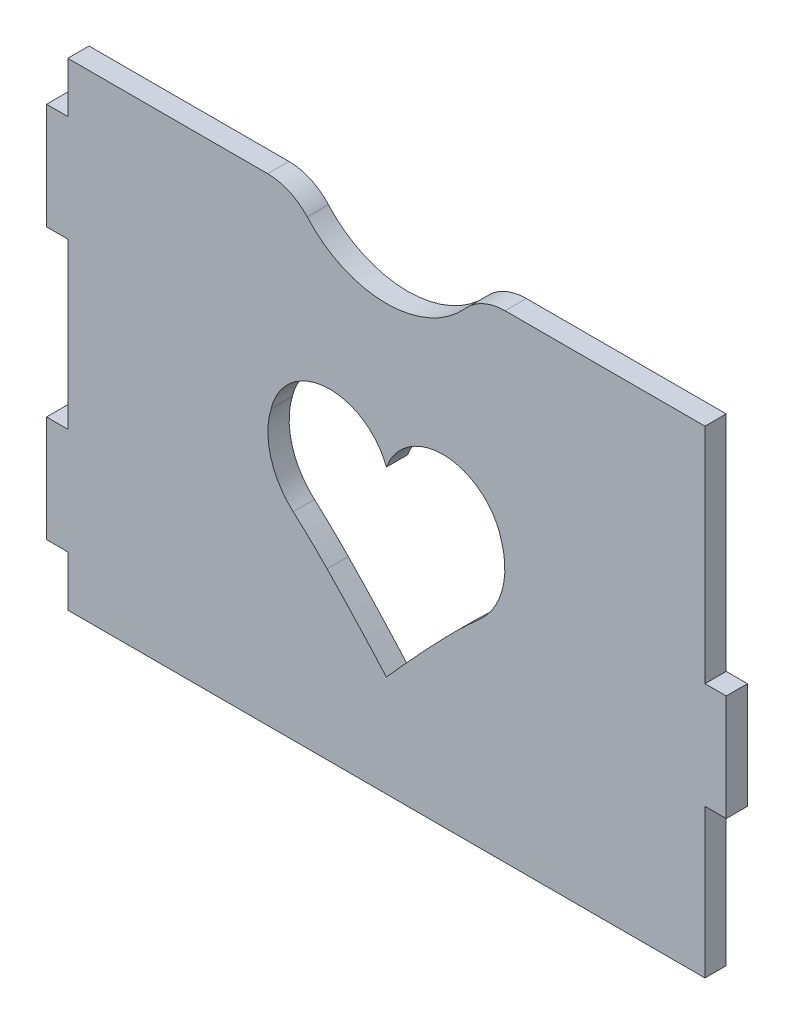
ISO-10303-21;
HEADER;
FILE_DESCRIPTION(('STEP AP214'),'2;1');
FILE_NAME('part.step','',(''),(''),'','','');
FILE_SCHEMA(('AUTOMOTIVE_DESIGN { 1 0 10303 214 1 1 1 1 }'));
ENDSEC;
DATA;
#1=APPLICATION_CONTEXT('core data for automotive mechanical design processes');
#2=APPLICATION_PROTOCOL_DEFINITION('international standard','automotive_design',2000,#1);
#3=PRODUCT_CONTEXT('',#1,'mechanical');
#4=PRODUCT('Part','Part','',(#3));
#5=PRODUCT_RELATED_PRODUCT_CATEGORY('part','',(#4));
#6=PRODUCT_DEFINITION_FORMATION('','',#4);
#7=PRODUCT_DEFINITION_CONTEXT('part definition',#1,'design');
#8=PRODUCT_DEFINITION('design','',#6,#7);
#9=PRODUCT_DEFINITION_SHAPE('','',#8);
#10=(LENGTH_UNIT() NAMED_UNIT(*) SI_UNIT(.MILLI.,.METRE.));
#11=(NAMED_UNIT(*) PLANE_ANGLE_UNIT() SI_UNIT($,.RADIAN.));
#12=(NAMED_UNIT(*) SI_UNIT($,.STERADIAN.) SOLID_ANGLE_UNIT());
#13=UNCERTAINTY_MEASURE_WITH_UNIT(LENGTH_MEASURE(1.E-05),#10,'distance_accuracy_value','');
#14=(GEOMETRIC_REPRESENTATION_CONTEXT(3) GLOBAL_UNCERTAINTY_ASSIGNED_CONTEXT((#13)) GLOBAL_UNIT_ASSIGNED_CONTEXT((#10,
#11,#12)) REPRESENTATION_CONTEXT('',''));
#15=CARTESIAN_POINT('',(0.,0.,0.));
#16=DIRECTION('',(0.,0.,1.));
#17=DIRECTION('',(1.,0.,0.));
#18=AXIS2_PLACEMENT_3D('',#15,#16,#17);
#19=CARTESIAN_POINT('',(-10.6492667971843,4.35046368248835,4.));
#20=DIRECTION('',(0.,0.,-1.));
#21=DIRECTION('',(-1.,0.,0.));
#22=AXIS2_PLACEMENT_3D('',#19,#20,#21);
#23=CYLINDRICAL_SURFACE('',#22,11.3667888290097);
#24=CARTESIAN_POINT('',(-10.6492667971843,4.35046368248835,0.));
#25=DIRECTION('',(0.,0.,1.));
#26=DIRECTION('',(1.,0.,0.));
#27=AXIS2_PLACEMENT_3D('',#24,#25,#26);
#28=CIRCLE('',#27,11.3667888290097);
#29=CARTESIAN_POINT('',(-1.26634813746307E-13,8.32500830617672,0.));
#30=VERTEX_POINT('',#29);
#31=CARTESIAN_POINT('',(-21.6936248246122,7.0385938960919,0.));
#32=VERTEX_POINT('',#31);
#33=EDGE_CURVE('E308',#30,#32,#28,.T.);
#34=ORIENTED_EDGE('',*,*,#33,.F.);
#35=DIRECTION('',(0.,0.,-1.));
#36=VECTOR('',#35,1.);
#37=CARTESIAN_POINT('',(-1.26634813746307E-13,8.32500830617672,4.));
#38=LINE('',#37,#36);
#39=CARTESIAN_POINT('',(-1.26634813746307E-13,8.32500830617672,4.));
#40=VERTEX_POINT('',#39);
#41=EDGE_CURVE('E11',#40,#30,#38,.T.);
#42=ORIENTED_EDGE('',*,*,#41,.F.);
#43=CARTESIAN_POINT('',(-10.6492667971843,4.35046368248835,4.));
#44=DIRECTION('',(0.,0.,1.));
#45=DIRECTION('',(1.,0.,0.));
#46=AXIS2_PLACEMENT_3D('',#43,#44,#45);
#47=CIRCLE('',#46,11.3667888290097);
#48=CARTESIAN_POINT('',(-21.6936248246122,7.0385938960919,4.));
#49=VERTEX_POINT('',#48);
#50=EDGE_CURVE('E444',#40,#49,#47,.T.);
#51=ORIENTED_EDGE('',*,*,#50,.T.);
#52=DIRECTION('',(0.,0.,-1.));
#53=VECTOR('',#52,1.);
#54=CARTESIAN_POINT('',(-21.6936248246122,7.0385938960919,4.));
#55=LINE('',#54,#53);
#56=EDGE_CURVE('E56',#49,#32,#55,.T.);
#57=ORIENTED_EDGE('',*,*,#56,.T.);
#58=EDGE_LOOP('',(#34,#42,#51,#57));
#59=FACE_BOUND('',#58,.T.);
#60=ADVANCED_FACE('F37',(#59),#23,.F.);
#61=CARTESIAN_POINT('',(10.649266797184,4.35046368248835,4.));
#62=DIRECTION('',(0.,0.,-1.));
#63=DIRECTION('',(-1.,0.,0.));
#64=AXIS2_PLACEMENT_3D('',#61,#62,#63);
#65=CYLINDRICAL_SURFACE('',#64,11.3667888290097);
#66=CARTESIAN_POINT('',(10.649266797184,4.35046368248835,0.));
#67=DIRECTION('',(0.,0.,1.));
#68=DIRECTION('',(1.,0.,0.));
#69=AXIS2_PLACEMENT_3D('',#66,#67,#68);
#70=CIRCLE('',#69,11.3667888290097);
#71=CARTESIAN_POINT('',(21.6936248246119,7.03859389609189,0.));
#72=VERTEX_POINT('',#71);
#73=EDGE_CURVE('E310',#30,#72,#70,.F.);
#74=ORIENTED_EDGE('',*,*,#73,.T.);
#75=DIRECTION('',(0.,0.,-1.));
#76=VECTOR('',#75,1.);
#77=CARTESIAN_POINT('',(21.6936248246119,7.03859389609189,4.));
#78=LINE('',#77,#76);
#79=CARTESIAN_POINT('',(21.6936248246119,7.03859389609189,4.));
#80=VERTEX_POINT('',#79);
#81=EDGE_CURVE('E47',#80,#72,#78,.T.);
#82=ORIENTED_EDGE('',*,*,#81,.F.);
#83=CARTESIAN_POINT('',(10.649266797184,4.35046368248835,4.));
#84=DIRECTION('',(0.,0.,1.));
#85=DIRECTION('',(1.,0.,0.));
#86=AXIS2_PLACEMENT_3D('',#83,#84,#85);
#87=CIRCLE('',#86,11.3667888290097);
#88=EDGE_CURVE('E446',#40,#80,#87,.F.);
#89=ORIENTED_EDGE('',*,*,#88,.F.);
#90=ORIENTED_EDGE('',*,*,#41,.T.);
#91=EDGE_LOOP('',(#74,#82,#89,#90));
#92=FACE_BOUND('',#91,.T.);
#93=ADVANCED_FACE('F475',(#92),#65,.F.);
#94=CARTESIAN_POINT('',(8.08489747060245,2.89555661326034,4.));
#95=DIRECTION('',(0.,0.,-1.));
#96=DIRECTION('',(-1.,0.,0.));
#97=AXIS2_PLACEMENT_3D('',#94,#95,#96);
#98=CYLINDRICAL_SURFACE('',#97,14.2254074852954);
#99=CARTESIAN_POINT('',(8.08489747060245,2.89555661326034,0.));
#100=DIRECTION('',(0.,0.,1.));
#101=DIRECTION('',(1.,0.,0.));
#102=AXIS2_PLACEMENT_3D('',#99,#100,#101);
#103=CIRCLE('',#102,14.2254074852954);
#104=CARTESIAN_POINT('',(17.5465918050056,-7.72699291333735,0.));
#105=VERTEX_POINT('',#104);
#106=EDGE_CURVE('E313',#72,#105,#103,.F.);
#107=ORIENTED_EDGE('',*,*,#106,.T.);
#108=DIRECTION('',(0.,0.,-1.));
#109=VECTOR('',#108,1.);
#110=CARTESIAN_POINT('',(17.5465918050056,-7.72699291333735,4.));
#111=LINE('',#110,#109);
#112=CARTESIAN_POINT('',(17.5465918050056,-7.72699291333735,4.));
#113=VERTEX_POINT('',#112);
#114=EDGE_CURVE('E335',#113,#105,#111,.T.);
#115=ORIENTED_EDGE('',*,*,#114,.F.);
#116=CARTESIAN_POINT('',(8.08489747060245,2.89555661326034,4.));
#117=DIRECTION('',(0.,0.,1.));
#118=DIRECTION('',(1.,0.,0.));
#119=AXIS2_PLACEMENT_3D('',#116,#117,#118);
#120=CIRCLE('',#119,14.2254074852954);
#121=EDGE_CURVE('E449',#80,#113,#120,.F.);
#122=ORIENTED_EDGE('',*,*,#121,.F.);
#123=ORIENTED_EDGE('',*,*,#81,.T.);
#124=EDGE_LOOP('',(#107,#115,#122,#123));
#125=FACE_BOUND('',#124,.T.);
#126=ADVANCED_FACE('F480',(#125),#98,.F.);
#127=CARTESIAN_POINT('',(97.3617620419237,-97.3346856637468,4.));
#128=DIRECTION('',(0.,0.,-1.));
#129=DIRECTION('',(-1.,0.,0.));
#130=AXIS2_PLACEMENT_3D('',#127,#128,#129);
#131=CYLINDRICAL_SURFACE('',#130,120.);
#132=CARTESIAN_POINT('',(97.3617620419237,-97.3346856637468,0.));
#133=DIRECTION('',(0.,0.,1.));
#134=DIRECTION('',(1.,0.,0.));
#135=AXIS2_PLACEMENT_3D('',#132,#133,#134);
#136=CIRCLE('',#135,120.);
#137=CARTESIAN_POINT('',(11.1634442061311,-13.8490581445165,0.));
#138=VERTEX_POINT('',#137);
#139=EDGE_CURVE('E316',#105,#138,#136,.T.);
#140=ORIENTED_EDGE('',*,*,#139,.T.);
#141=DIRECTION('',(0.,0.,-1.));
#142=VECTOR('',#141,1.);
#143=CARTESIAN_POINT('',(11.1634442061311,-13.8490581445165,4.));
#144=LINE('',#143,#142);
#145=CARTESIAN_POINT('',(11.1634442061311,-13.8490581445165,4.));
#146=VERTEX_POINT('',#145);
#147=EDGE_CURVE('E332',#146,#138,#144,.T.);
#148=ORIENTED_EDGE('',*,*,#147,.F.);
#149=CARTESIAN_POINT('',(97.3617620419237,-97.3346856637468,4.));
#150=DIRECTION('',(0.,0.,1.));
#151=DIRECTION('',(1.,0.,0.));
#152=AXIS2_PLACEMENT_3D('',#149,#150,#151);
#153=CIRCLE('',#152,120.);
#154=EDGE_CURVE('E452',#113,#146,#153,.T.);
#155=ORIENTED_EDGE('',*,*,#154,.F.);
#156=ORIENTED_EDGE('',*,*,#114,.T.);
#157=EDGE_LOOP('',(#140,#148,#155,#156));
#158=FACE_BOUND('',#157,.T.);
#159=ADVANCED_FACE('F456',(#158),#131,.T.);
#160=CARTESIAN_POINT('',(266.96644879788,-261.601855366494,4.));
#161=DIRECTION('',(0.,0.,-1.));
#162=DIRECTION('',(-1.,0.,0.));
#163=AXIS2_PLACEMENT_3D('',#160,#161,#162);
#164=CYLINDRICAL_SURFACE('',#163,356.113220323932);
#165=CARTESIAN_POINT('',(266.96644879788,-261.601855366494,0.));
#166=DIRECTION('',(0.,0.,1.));
#167=DIRECTION('',(1.,0.,0.));
#168=AXIS2_PLACEMENT_3D('',#165,#166,#167);
#169=CIRCLE('',#168,356.113220323932);
#170=CARTESIAN_POINT('',(0.,-25.9208402088673,0.));
#171=VERTEX_POINT('',#170);
#172=EDGE_CURVE('E319',#138,#171,#169,.T.);
#173=ORIENTED_EDGE('',*,*,#172,.T.);
#174=DIRECTION('',(0.,0.,-1.));
#175=VECTOR('',#174,1.);
#176=CARTESIAN_POINT('',(0.,-25.9208402088673,4.));
#177=LINE('',#176,#175);
#178=CARTESIAN_POINT('',(0.,-25.9208402088673,4.));
#179=VERTEX_POINT('',#178);
#180=EDGE_CURVE('E238',#179,#171,#177,.T.);
#181=ORIENTED_EDGE('',*,*,#180,.F.);
#182=CARTESIAN_POINT('',(266.96644879788,-261.601855366494,4.));
#183=DIRECTION('',(0.,0.,1.));
#184=DIRECTION('',(1.,0.,0.));
#185=AXIS2_PLACEMENT_3D('',#182,#183,#184);
#186=CIRCLE('',#185,356.113220323932);
#187=EDGE_CURVE('E247',#146,#179,#186,.T.);
#188=ORIENTED_EDGE('',*,*,#187,.F.);
#189=ORIENTED_EDGE('',*,*,#147,.T.);
#190=EDGE_LOOP('',(#173,#181,#188,#189));
#191=FACE_BOUND('',#190,.T.);
#192=ADVANCED_FACE('F458',(#191),#164,.T.);
#193=CARTESIAN_POINT('',(-266.966448797881,-261.601855366494,4.));
#194=DIRECTION('',(0.,0.,-1.));
#195=DIRECTION('',(-1.,0.,0.));
#196=AXIS2_PLACEMENT_3D('',#193,#194,#195);
#197=CYLINDRICAL_SURFACE('',#196,356.113220323932);
#198=CARTESIAN_POINT('',(-266.966448797881,-261.601855366494,0.));
#199=DIRECTION('',(0.,0.,1.));
#200=DIRECTION('',(1.,0.,0.));
#201=AXIS2_PLACEMENT_3D('',#198,#199,#200);
#202=CIRCLE('',#201,356.113220323932);
#203=CARTESIAN_POINT('',(-11.1634442061314,-13.8490581445164,0.));
#204=VERTEX_POINT('',#203);
#205=EDGE_CURVE('E234',#204,#171,#202,.F.);
#206=ORIENTED_EDGE('',*,*,#205,.F.);
#207=DIRECTION('',(0.,0.,-1.));
#208=VECTOR('',#207,1.);
#209=CARTESIAN_POINT('',(-11.1634442061314,-13.8490581445164,4.));
#210=LINE('',#209,#208);
#211=CARTESIAN_POINT('',(-11.1634442061314,-13.8490581445164,4.));
#212=VERTEX_POINT('',#211);
#213=EDGE_CURVE('E229',#212,#204,#210,.T.);
#214=ORIENTED_EDGE('',*,*,#213,.F.);
#215=CARTESIAN_POINT('',(-266.966448797881,-261.601855366494,4.));
#216=DIRECTION('',(0.,0.,1.));
#217=DIRECTION('',(1.,0.,0.));
#218=AXIS2_PLACEMENT_3D('',#215,#216,#217);
#219=CIRCLE('',#218,356.113220323932);
#220=EDGE_CURVE('E232',#212,#179,#219,.F.);
#221=ORIENTED_EDGE('',*,*,#220,.T.);
#222=ORIENTED_EDGE('',*,*,#180,.T.);
#223=EDGE_LOOP('',(#206,#214,#221,#222));
#224=FACE_BOUND('',#223,.T.);
#225=ADVANCED_FACE('F231',(#224),#197,.T.);
#226=CARTESIAN_POINT('',(-97.361762041924,-97.3346856637468,4.));
#227=DIRECTION('',(0.,0.,-1.));
#228=DIRECTION('',(-1.,0.,0.));
#229=AXIS2_PLACEMENT_3D('',#226,#227,#228);
#230=CYLINDRICAL_SURFACE('',#229,120.);
#231=CARTESIAN_POINT('',(-97.361762041924,-97.3346856637468,0.));
#232=DIRECTION('',(0.,0.,1.));
#233=DIRECTION('',(1.,0.,0.));
#234=AXIS2_PLACEMENT_3D('',#231,#232,#233);
#235=CIRCLE('',#234,120.);
#236=CARTESIAN_POINT('',(-17.5465918050059,-7.72699291333736,0.));
#237=VERTEX_POINT('',#236);
#238=EDGE_CURVE('E323',#237,#204,#235,.F.);
#239=ORIENTED_EDGE('',*,*,#238,.F.);
#240=DIRECTION('',(0.,0.,-1.));
#241=VECTOR('',#240,1.);
#242=CARTESIAN_POINT('',(-17.5465918050059,-7.72699291333736,4.));
#243=LINE('',#242,#241);
#244=CARTESIAN_POINT('',(-17.5465918050059,-7.72699291333736,4.));
#245=VERTEX_POINT('',#244);
#246=EDGE_CURVE('E141',#245,#237,#243,.T.);
#247=ORIENTED_EDGE('',*,*,#246,.F.);
#248=CARTESIAN_POINT('',(-97.361762041924,-97.3346856637468,4.));
#249=DIRECTION('',(0.,0.,1.));
#250=DIRECTION('',(1.,0.,0.));
#251=AXIS2_PLACEMENT_3D('',#248,#249,#250);
#252=CIRCLE('',#251,120.);
#253=EDGE_CURVE('E245',#245,#212,#252,.F.);
#254=ORIENTED_EDGE('',*,*,#253,.T.);
#255=ORIENTED_EDGE('',*,*,#213,.T.);
#256=EDGE_LOOP('',(#239,#247,#254,#255));
#257=FACE_BOUND('',#256,.T.);
#258=ADVANCED_FACE('F250',(#257),#230,.T.);
#259=CARTESIAN_POINT('',(22.3606797749979,35.,4.));
#260=DIRECTION('',(0.,0.,-1.));
#261=DIRECTION('',(-1.,0.,0.));
#262=AXIS2_PLACEMENT_3D('',#259,#260,#261);
#263=CYLINDRICAL_SURFACE('',#262,10.);
#264=CARTESIAN_POINT('',(22.3606797749979,35.,0.));
#265=DIRECTION('',(0.,0.,1.));
#266=DIRECTION('',(1.,0.,0.));
#267=AXIS2_PLACEMENT_3D('',#264,#265,#266);
#268=CIRCLE('',#267,10.);
#269=CARTESIAN_POINT('',(14.9071198499986,41.6666666666666,0.));
#270=VERTEX_POINT('',#269);
#271=CARTESIAN_POINT('',(22.3606797749979,45.,0.));
#272=VERTEX_POINT('',#271);
#273=EDGE_CURVE('E257',#270,#272,#268,.F.);
#274=ORIENTED_EDGE('',*,*,#273,.F.);
#275=DIRECTION('',(0.,0.,-1.));
#276=VECTOR('',#275,1.);
#277=CARTESIAN_POINT('',(14.9071198499986,41.6666666666666,4.));
#278=LINE('',#277,#276);
#279=CARTESIAN_POINT('',(14.9071198499986,41.6666666666666,4.));
#280=VERTEX_POINT('',#279);
#281=EDGE_CURVE('E41',#280,#270,#278,.T.);
#282=ORIENTED_EDGE('',*,*,#281,.F.);
#283=CARTESIAN_POINT('',(22.3606797749979,35.,4.));
#284=DIRECTION('',(0.,0.,1.));
#285=DIRECTION('',(1.,0.,0.));
#286=AXIS2_PLACEMENT_3D('',#283,#284,#285);
#287=CIRCLE('',#286,10.);
#288=CARTESIAN_POINT('',(22.3606797749979,45.,4.));
#289=VERTEX_POINT('',#288);
#290=EDGE_CURVE('E328',#280,#289,#287,.F.);
#291=ORIENTED_EDGE('',*,*,#290,.T.);
#292=DIRECTION('',(0.,0.,-1.));
#293=VECTOR('',#292,1.);
#294=CARTESIAN_POINT('',(22.3606797749979,45.,4.));
#295=LINE('',#294,#293);
#296=EDGE_CURVE('E253',#289,#272,#295,.T.);
#297=ORIENTED_EDGE('',*,*,#296,.T.);
#298=EDGE_LOOP('',(#274,#282,#291,#297));
#299=FACE_BOUND('',#298,.T.);
#300=ADVANCED_FACE('F39',(#299),#263,.T.);
#301=CARTESIAN_POINT('',(0.,55.,4.));
#302=DIRECTION('',(0.,0.,-1.));
#303=DIRECTION('',(-1.,0.,0.));
#304=AXIS2_PLACEMENT_3D('',#301,#302,#303);
#305=CYLINDRICAL_SURFACE('',#304,20.);
#306=CARTESIAN_POINT('',(0.,55.,0.));
#307=DIRECTION('',(0.,0.,1.));
#308=DIRECTION('',(1.,0.,0.));
#309=AXIS2_PLACEMENT_3D('',#306,#307,#308);
#310=CIRCLE('',#309,20.);
#311=CARTESIAN_POINT('',(-14.9071198499986,41.6666666666666,0.));
#312=VERTEX_POINT('',#311);
#313=EDGE_CURVE('E260',#312,#270,#310,.T.);
#314=ORIENTED_EDGE('',*,*,#313,.F.);
#315=DIRECTION('',(0.,0.,-1.));
#316=VECTOR('',#315,1.);
#317=CARTESIAN_POINT('',(-14.9071198499986,41.6666666666666,4.));
#318=LINE('',#317,#316);
#319=CARTESIAN_POINT('',(-14.9071198499986,41.6666666666666,4.));
#320=VERTEX_POINT('',#319);
#321=EDGE_CURVE('E379',#320,#312,#318,.T.);
#322=ORIENTED_EDGE('',*,*,#321,.F.);
#323=CARTESIAN_POINT('',(0.,55.,4.));
#324=DIRECTION('',(0.,0.,1.));
#325=DIRECTION('',(1.,0.,0.));
#326=AXIS2_PLACEMENT_3D('',#323,#324,#325);
#327=CIRCLE('',#326,20.);
#328=EDGE_CURVE('E388',#320,#280,#327,.T.);
#329=ORIENTED_EDGE('',*,*,#328,.T.);
#330=ORIENTED_EDGE('',*,*,#281,.T.);
#331=EDGE_LOOP('',(#314,#322,#329,#330));
#332=FACE_BOUND('',#331,.T.);
#333=ADVANCED_FACE('F386',(#332),#305,.F.);
#334=CARTESIAN_POINT('',(-22.3606797749979,35.,4.));
#335=DIRECTION('',(0.,0.,-1.));
#336=DIRECTION('',(-1.,0.,0.));
#337=AXIS2_PLACEMENT_3D('',#334,#335,#336);
#338=CYLINDRICAL_SURFACE('',#337,10.);
#339=CARTESIAN_POINT('',(-22.3606797749979,35.,0.));
#340=DIRECTION('',(0.,0.,1.));
#341=DIRECTION('',(1.,0.,0.));
#342=AXIS2_PLACEMENT_3D('',#339,#340,#341);
#343=CIRCLE('',#342,10.);
#344=CARTESIAN_POINT('',(-22.3606797749979,45.,0.));
#345=VERTEX_POINT('',#344);
#346=EDGE_CURVE('E263',#345,#312,#343,.F.);
#347=ORIENTED_EDGE('',*,*,#346,.F.);
#348=DIRECTION('',(0.,0.,-1.));
#349=VECTOR('',#348,1.);
#350=CARTESIAN_POINT('',(-22.3606797749979,45.,4.));
#351=LINE('',#350,#349);
#352=CARTESIAN_POINT('',(-22.3606797749979,45.,4.));
#353=VERTEX_POINT('',#352);
#354=EDGE_CURVE('E378',#353,#345,#351,.T.);
#355=ORIENTED_EDGE('',*,*,#354,.F.);
#356=CARTESIAN_POINT('',(-22.3606797749979,35.,4.));
#357=DIRECTION('',(0.,0.,1.));
#358=DIRECTION('',(1.,0.,0.));
#359=AXIS2_PLACEMENT_3D('',#356,#357,#358);
#360=CIRCLE('',#359,10.);
#361=EDGE_CURVE('E397',#353,#320,#360,.F.);
#362=ORIENTED_EDGE('',*,*,#361,.T.);
#363=ORIENTED_EDGE('',*,*,#321,.T.);
#364=EDGE_LOOP('',(#347,#355,#362,#363));
#365=FACE_BOUND('',#364,.T.);
#366=ADVANCED_FACE('F395',(#365),#338,.T.);
#367=CARTESIAN_POINT('',(0.,45.,4.));
#368=DIRECTION('',(0.,1.,0.));
#369=DIRECTION('',(-1.,0.,0.));
#370=AXIS2_PLACEMENT_3D('',#367,#368,#369);
#371=PLANE('',#370);
#372=DIRECTION('',(1.,0.,0.));
#373=VECTOR('',#372,1.);
#374=CARTESIAN_POINT('',(0.,45.,0.));
#375=LINE('',#374,#373);
#376=CARTESIAN_POINT('',(-60.,45.,0.));
#377=VERTEX_POINT('',#376);
#378=EDGE_CURVE('E266',#377,#345,#375,.T.);
#379=ORIENTED_EDGE('',*,*,#378,.F.);
#380=DIRECTION('',(0.,0.,-1.));
#381=VECTOR('',#380,1.);
#382=CARTESIAN_POINT('',(-60.,45.,4.));
#383=LINE('',#382,#381);
#384=CARTESIAN_POINT('',(-60.,45.,4.));
#385=VERTEX_POINT('',#384);
#386=EDGE_CURVE('E376',#385,#377,#383,.T.);
#387=ORIENTED_EDGE('',*,*,#386,.F.);
#388=DIRECTION('',(1.,0.,0.));
#389=VECTOR('',#388,1.);
#390=CARTESIAN_POINT('',(0.,45.,4.));
#391=LINE('',#390,#389);
#392=EDGE_CURVE('E402',#385,#353,#391,.T.);
#393=ORIENTED_EDGE('',*,*,#392,.T.);
#394=ORIENTED_EDGE('',*,*,#354,.T.);
#395=EDGE_LOOP('',(#379,#387,#393,#394));
#396=FACE_BOUND('',#395,.T.);
#397=ADVANCED_FACE('F404',(#396),#371,.T.);
#398=CARTESIAN_POINT('',(-60.,0.,4.));
#399=DIRECTION('',(1.,0.,0.));
#400=DIRECTION('',(0.,1.,0.));
#401=AXIS2_PLACEMENT_3D('',#398,#399,#400);
#402=PLANE('',#401);
#403=DIRECTION('',(0.,-1.,0.));
#404=VECTOR('',#403,1.);
#405=CARTESIAN_POINT('',(-60.,0.,0.));
#406=LINE('',#405,#404);
#407=CARTESIAN_POINT('',(-60.,35.5,0.));
#408=VERTEX_POINT('',#407);
#409=EDGE_CURVE('E269',#377,#408,#406,.T.);
#410=ORIENTED_EDGE('',*,*,#409,.T.);
#411=DIRECTION('',(0.,0.,-1.));
#412=VECTOR('',#411,1.);
#413=CARTESIAN_POINT('',(-60.,35.5,4.));
#414=LINE('',#413,#412);
#415=CARTESIAN_POINT('',(-60.,35.5,4.));
#416=VERTEX_POINT('',#415);
#417=EDGE_CURVE('E373',#416,#408,#414,.T.);
#418=ORIENTED_EDGE('',*,*,#417,.F.);
#419=DIRECTION('',(0.,-1.,0.));
#420=VECTOR('',#419,1.);
#421=CARTESIAN_POINT('',(-60.,0.,4.));
#422=LINE('',#421,#420);
#423=EDGE_CURVE('E406',#385,#416,#422,.T.);
#424=ORIENTED_EDGE('',*,*,#423,.F.);
#425=ORIENTED_EDGE('',*,*,#386,.T.);
#426=EDGE_LOOP('',(#410,#418,#424,#425));
#427=FACE_BOUND('',#426,.T.);
#428=ADVANCED_FACE('F510',(#427),#402,.F.);
#429=CARTESIAN_POINT('',(0.,35.5,4.));
#430=DIRECTION('',(0.,-1.,0.));
#431=DIRECTION('',(0.,0.,-1.));
#432=AXIS2_PLACEMENT_3D('',#429,#430,#431);
#433=PLANE('',#432);
#434=DIRECTION('',(-1.,0.,0.));
#435=VECTOR('',#434,1.);
#436=CARTESIAN_POINT('',(0.,35.5,0.));
#437=LINE('',#436,#435);
#438=CARTESIAN_POINT('',(-64.,35.5,0.));
#439=VERTEX_POINT('',#438);
#440=EDGE_CURVE('E271',#408,#439,#437,.T.);
#441=ORIENTED_EDGE('',*,*,#440,.T.);
#442=DIRECTION('',(0.,0.,-1.));
#443=VECTOR('',#442,1.);
#444=CARTESIAN_POINT('',(-64.,35.5,4.));
#445=LINE('',#444,#443);
#446=CARTESIAN_POINT('',(-64.,35.5,4.));
#447=VERTEX_POINT('',#446);
#448=EDGE_CURVE('E371',#447,#439,#445,.T.);
#449=ORIENTED_EDGE('',*,*,#448,.F.);
#450=DIRECTION('',(-1.,0.,0.));
#451=VECTOR('',#450,1.);
#452=CARTESIAN_POINT('',(0.,35.5,4.));
#453=LINE('',#452,#451);
#454=EDGE_CURVE('E408',#416,#447,#453,.T.);
#455=ORIENTED_EDGE('',*,*,#454,.F.);
#456=ORIENTED_EDGE('',*,*,#417,.T.);
#457=EDGE_LOOP('',(#441,#449,#455,#456));
#458=FACE_BOUND('',#457,.T.);
#459=ADVANCED_FACE('F530',(#458),#433,.F.);
#460=CARTESIAN_POINT('',(-64.,0.,4.));
#461=DIRECTION('',(-1.,0.,0.));
#462=DIRECTION('',(0.,-1.,0.));
#463=AXIS2_PLACEMENT_3D('',#460,#461,#462);
#464=PLANE('',#463);
#465=DIRECTION('',(0.,1.,0.));
#466=VECTOR('',#465,1.);
#467=CARTESIAN_POINT('',(-64.,0.,0.));
#468=LINE('',#467,#466);
#469=CARTESIAN_POINT('',(-64.,15.5,0.));
#470=VERTEX_POINT('',#469);
#471=EDGE_CURVE('E276',#470,#439,#468,.T.);
#472=ORIENTED_EDGE('',*,*,#471,.F.);
#473=DIRECTION('',(0.,0.,-1.));
#474=VECTOR('',#473,1.);
#475=CARTESIAN_POINT('',(-64.,15.5,4.));
#476=LINE('',#475,#474);
#477=CARTESIAN_POINT('',(-64.,15.5,4.));
#478=VERTEX_POINT('',#477);
#479=EDGE_CURVE('E369',#478,#470,#476,.T.);
#480=ORIENTED_EDGE('',*,*,#479,.F.);
#481=DIRECTION('',(0.,1.,0.));
#482=VECTOR('',#481,1.);
#483=CARTESIAN_POINT('',(-64.,0.,4.));
#484=LINE('',#483,#482);
#485=EDGE_CURVE('E415',#478,#447,#484,.T.);
#486=ORIENTED_EDGE('',*,*,#485,.T.);
#487=ORIENTED_EDGE('',*,*,#448,.T.);
#488=EDGE_LOOP('',(#472,#480,#486,#487));
#489=FACE_BOUND('',#488,.T.);
#490=ADVANCED_FACE('F526',(#489),#464,.T.);
#491=CARTESIAN_POINT('',(0.,15.5,4.));
#492=DIRECTION('',(0.,-1.,0.));
#493=DIRECTION('',(1.,0.,0.));
#494=AXIS2_PLACEMENT_3D('',#491,#492,#493);
#495=PLANE('',#494);
#496=DIRECTION('',(-1.,0.,0.));
#497=VECTOR('',#496,1.);
#498=CARTESIAN_POINT('',(0.,15.5,0.));
#499=LINE('',#498,#497);
#500=CARTESIAN_POINT('',(-60.,15.5,0.));
#501=VERTEX_POINT('',#500);
#502=EDGE_CURVE('E279',#501,#470,#499,.T.);
#503=ORIENTED_EDGE('',*,*,#502,.F.);
#504=DIRECTION('',(0.,0.,-1.));
#505=VECTOR('',#504,1.);
#506=CARTESIAN_POINT('',(-60.,15.5,4.));
#507=LINE('',#506,#505);
#508=CARTESIAN_POINT('',(-60.,15.5,4.));
#509=VERTEX_POINT('',#508);
#510=EDGE_CURVE('E367',#509,#501,#507,.T.);
#511=ORIENTED_EDGE('',*,*,#510,.F.);
#512=DIRECTION('',(-1.,0.,0.));
#513=VECTOR('',#512,1.);
#514=CARTESIAN_POINT('',(0.,15.5,4.));
#515=LINE('',#514,#513);
#516=EDGE_CURVE('E418',#509,#478,#515,.T.);
#517=ORIENTED_EDGE('',*,*,#516,.T.);
#518=ORIENTED_EDGE('',*,*,#479,.T.);
#519=EDGE_LOOP('',(#503,#511,#517,#518));
#520=FACE_BOUND('',#519,.T.);
#521=ADVANCED_FACE('F523',(#520),#495,.T.);
#522=CARTESIAN_POINT('',(-60.,-15.5,0.));
#523=VERTEX_POINT('',#522);
#524=EDGE_CURVE('E273',#501,#523,#406,.T.);
#525=ORIENTED_EDGE('',*,*,#524,.T.);
#526=DIRECTION('',(0.,0.,-1.));
#527=VECTOR('',#526,1.);
#528=CARTESIAN_POINT('',(-60.,-15.5,4.));
#529=LINE('',#528,#527);
#530=CARTESIAN_POINT('',(-60.,-15.5,4.));
#531=VERTEX_POINT('',#530);
#532=EDGE_CURVE('E364',#531,#523,#529,.T.);
#533=ORIENTED_EDGE('',*,*,#532,.F.);
#534=EDGE_CURVE('E411',#509,#531,#422,.T.);
#535=ORIENTED_EDGE('',*,*,#534,.F.);
#536=ORIENTED_EDGE('',*,*,#510,.T.);
#537=EDGE_LOOP('',(#525,#533,#535,#536));
#538=FACE_BOUND('',#537,.T.);
#539=ADVANCED_FACE('F511',(#538),#402,.F.);
#540=CARTESIAN_POINT('',(0.,-15.5,4.));
#541=DIRECTION('',(0.,-1.,0.));
#542=DIRECTION('',(0.,0.,-1.));
#543=AXIS2_PLACEMENT_3D('',#540,#541,#542);
#544=PLANE('',#543);
#545=DIRECTION('',(-1.,0.,0.));
#546=VECTOR('',#545,1.);
#547=CARTESIAN_POINT('',(0.,-15.5,0.));
#548=LINE('',#547,#546);
#549=CARTESIAN_POINT('',(-64.,-15.5,0.));
#550=VERTEX_POINT('',#549);
#551=EDGE_CURVE('E282',#523,#550,#548,.T.);
#552=ORIENTED_EDGE('',*,*,#551,.T.);
#553=DIRECTION('',(0.,0.,-1.));
#554=VECTOR('',#553,1.);
#555=CARTESIAN_POINT('',(-64.,-15.5,4.));
#556=LINE('',#555,#554);
#557=CARTESIAN_POINT('',(-64.,-15.5,4.));
#558=VERTEX_POINT('',#557);
#559=EDGE_CURVE('E361',#558,#550,#556,.T.);
#560=ORIENTED_EDGE('',*,*,#559,.F.);
#561=DIRECTION('',(-1.,0.,0.));
#562=VECTOR('',#561,1.);
#563=CARTESIAN_POINT('',(0.,-15.5,4.));
#564=LINE('',#563,#562);
#565=EDGE_CURVE('E421',#531,#558,#564,.T.);
#566=ORIENTED_EDGE('',*,*,#565,.F.);
#567=ORIENTED_EDGE('',*,*,#532,.T.);
#568=EDGE_LOOP('',(#552,#560,#566,#567));
#569=FACE_BOUND('',#568,.T.);
#570=ADVANCED_FACE('F518',(#569),#544,.F.);
#571=CARTESIAN_POINT('',(-64.,0.,4.));
#572=DIRECTION('',(1.,0.,0.));
#573=DIRECTION('',(0.,0.,-1.));
#574=AXIS2_PLACEMENT_3D('',#571,#572,#573);
#575=PLANE('',#574);
#576=DIRECTION('',(0.,-1.,0.));
#577=VECTOR('',#576,1.);
#578=CARTESIAN_POINT('',(-64.,0.,0.));
#579=LINE('',#578,#577);
#580=CARTESIAN_POINT('',(-64.,-35.5,0.));
#581=VERTEX_POINT('',#580);
#582=EDGE_CURVE('E284',#550,#581,#579,.T.);
#583=ORIENTED_EDGE('',*,*,#582,.T.);
#584=DIRECTION('',(0.,0.,-1.));
#585=VECTOR('',#584,1.);
#586=CARTESIAN_POINT('',(-64.,-35.5,4.));
#587=LINE('',#586,#585);
#588=CARTESIAN_POINT('',(-64.,-35.5,4.));
#589=VERTEX_POINT('',#588);
#590=EDGE_CURVE('E359',#589,#581,#587,.T.);
#591=ORIENTED_EDGE('',*,*,#590,.F.);
#592=DIRECTION('',(0.,-1.,0.));
#593=VECTOR('',#592,1.);
#594=CARTESIAN_POINT('',(-64.,0.,4.));
#595=LINE('',#594,#593);
#596=EDGE_CURVE('E423',#558,#589,#595,.T.);
#597=ORIENTED_EDGE('',*,*,#596,.F.);
#598=ORIENTED_EDGE('',*,*,#559,.T.);
#599=EDGE_LOOP('',(#583,#591,#597,#598));
#600=FACE_BOUND('',#599,.T.);
#601=ADVANCED_FACE('F514',(#600),#575,.F.);
#602=CARTESIAN_POINT('',(0.,-35.5,4.));
#603=DIRECTION('',(0.,-1.,0.));
#604=DIRECTION('',(0.,0.,-1.));
#605=AXIS2_PLACEMENT_3D('',#602,#603,#604);
#606=PLANE('',#605);
#607=DIRECTION('',(-1.,0.,0.));
#608=VECTOR('',#607,1.);
#609=CARTESIAN_POINT('',(0.,-35.5,0.));
#610=LINE('',#609,#608);
#611=CARTESIAN_POINT('',(-60.,-35.5,0.));
#612=VERTEX_POINT('',#611);
#613=EDGE_CURVE('E287',#612,#581,#610,.T.);
#614=ORIENTED_EDGE('',*,*,#613,.F.);
#615=DIRECTION('',(0.,0.,-1.));
#616=VECTOR('',#615,1.);
#617=CARTESIAN_POINT('',(-60.,-35.5,4.));
#618=LINE('',#617,#616);
#619=CARTESIAN_POINT('',(-60.,-35.5,4.));
#620=VERTEX_POINT('',#619);
#621=EDGE_CURVE('E357',#620,#612,#618,.T.);
#622=ORIENTED_EDGE('',*,*,#621,.F.);
#623=DIRECTION('',(-1.,0.,0.));
#624=VECTOR('',#623,1.);
#625=CARTESIAN_POINT('',(0.,-35.5,4.));
#626=LINE('',#625,#624);
#627=EDGE_CURVE('E425',#620,#589,#626,.T.);
#628=ORIENTED_EDGE('',*,*,#627,.T.);
#629=ORIENTED_EDGE('',*,*,#590,.T.);
#630=EDGE_LOOP('',(#614,#622,#628,#629));
#631=FACE_BOUND('',#630,.T.);
#632=ADVANCED_FACE('F508',(#631),#606,.T.);
#633=CARTESIAN_POINT('',(-60.,-45.,0.));
#634=VERTEX_POINT('',#633);
#635=EDGE_CURVE('E272',#612,#634,#406,.T.);
#636=ORIENTED_EDGE('',*,*,#635,.T.);
#637=DIRECTION('',(0.,0.,-1.));
#638=VECTOR('',#637,1.);
#639=CARTESIAN_POINT('',(-60.,-45.,4.));
#640=LINE('',#639,#638);
#641=CARTESIAN_POINT('',(-60.,-45.,4.));
#642=VERTEX_POINT('',#641);
#643=EDGE_CURVE('E354',#642,#634,#640,.T.);
#644=ORIENTED_EDGE('',*,*,#643,.F.);
#645=EDGE_CURVE('E410',#620,#642,#422,.T.);
#646=ORIENTED_EDGE('',*,*,#645,.F.);
#647=ORIENTED_EDGE('',*,*,#621,.T.);
#648=EDGE_LOOP('',(#636,#644,#646,#647));
#649=FACE_BOUND('',#648,.T.);
#650=ADVANCED_FACE('F504',(#649),#402,.F.);
#651=CARTESIAN_POINT('',(0.,-45.,4.));
#652=DIRECTION('',(0.,1.,0.));
#653=DIRECTION('',(-1.,0.,0.));
#654=AXIS2_PLACEMENT_3D('',#651,#652,#653);
#655=PLANE('',#654);
#656=DIRECTION('',(1.,0.,0.));
#657=VECTOR('',#656,1.);
#658=CARTESIAN_POINT('',(0.,-45.,0.));
#659=LINE('',#658,#657);
#660=CARTESIAN_POINT('',(60.,-45.,0.));
#661=VERTEX_POINT('',#660);
#662=EDGE_CURVE('E290',#634,#661,#659,.T.);
#663=ORIENTED_EDGE('',*,*,#662,.T.);
#664=DIRECTION('',(0.,0.,-1.));
#665=VECTOR('',#664,1.);
#666=CARTESIAN_POINT('',(60.,-45.,4.));
#667=LINE('',#666,#665);
#668=CARTESIAN_POINT('',(60.,-45.,4.));
#669=VERTEX_POINT('',#668);
#670=EDGE_CURVE('E352',#669,#661,#667,.T.);
#671=ORIENTED_EDGE('',*,*,#670,.F.);
#672=DIRECTION('',(1.,0.,0.));
#673=VECTOR('',#672,1.);
#674=CARTESIAN_POINT('',(0.,-45.,4.));
#675=LINE('',#674,#673);
#676=EDGE_CURVE('E428',#642,#669,#675,.T.);
#677=ORIENTED_EDGE('',*,*,#676,.F.);
#678=ORIENTED_EDGE('',*,*,#643,.T.);
#679=EDGE_LOOP('',(#663,#671,#677,#678));
#680=FACE_BOUND('',#679,.T.);
#681=ADVANCED_FACE('F501',(#680),#655,.F.);
#682=CARTESIAN_POINT('',(60.,0.,4.));
#683=DIRECTION('',(1.,0.,0.));
#684=DIRECTION('',(0.,1.,0.));
#685=AXIS2_PLACEMENT_3D('',#682,#683,#684);
#686=PLANE('',#685);
#687=DIRECTION('',(0.,-1.,0.));
#688=VECTOR('',#687,1.);
#689=CARTESIAN_POINT('',(60.,0.,0.));
#690=LINE('',#689,#688);
#691=CARTESIAN_POINT('',(60.,-17.,0.));
#692=VERTEX_POINT('',#691);
#693=EDGE_CURVE('E293',#692,#661,#690,.T.);
#694=ORIENTED_EDGE('',*,*,#693,.F.);
#695=DIRECTION('',(0.,0.,-1.));
#696=VECTOR('',#695,1.);
#697=CARTESIAN_POINT('',(60.,-17.,4.));
#698=LINE('',#697,#696);
#699=CARTESIAN_POINT('',(60.,-17.,4.));
#700=VERTEX_POINT('',#699);
#701=EDGE_CURVE('E350',#700,#692,#698,.T.);
#702=ORIENTED_EDGE('',*,*,#701,.F.);
#703=DIRECTION('',(0.,-1.,0.));
#704=VECTOR('',#703,1.);
#705=CARTESIAN_POINT('',(60.,0.,4.));
#706=LINE('',#705,#704);
#707=EDGE_CURVE('E430',#700,#669,#706,.T.);
#708=ORIENTED_EDGE('',*,*,#707,.T.);
#709=ORIENTED_EDGE('',*,*,#670,.T.);
#710=EDGE_LOOP('',(#694,#702,#708,#709));
#711=FACE_BOUND('',#710,.T.);
#712=ADVANCED_FACE('F489',(#711),#686,.T.);
#713=CARTESIAN_POINT('',(0.,-17.,4.));
#714=DIRECTION('',(0.,1.,0.));
#715=DIRECTION('',(0.,0.,1.));
#716=AXIS2_PLACEMENT_3D('',#713,#714,#715);
#717=PLANE('',#716);
#718=DIRECTION('',(1.,0.,0.));
#719=VECTOR('',#718,1.);
#720=CARTESIAN_POINT('',(0.,-17.,0.));
#721=LINE('',#720,#719);
#722=CARTESIAN_POINT('',(64.,-17.,0.));
#723=VERTEX_POINT('',#722);
#724=EDGE_CURVE('E296',#692,#723,#721,.T.);
#725=ORIENTED_EDGE('',*,*,#724,.T.);
#726=DIRECTION('',(0.,0.,-1.));
#727=VECTOR('',#726,1.);
#728=CARTESIAN_POINT('',(64.,-17.,4.));
#729=LINE('',#728,#727);
#730=CARTESIAN_POINT('',(64.,-17.,4.));
#731=VERTEX_POINT('',#730);
#732=EDGE_CURVE('E347',#731,#723,#729,.T.);
#733=ORIENTED_EDGE('',*,*,#732,.F.);
#734=DIRECTION('',(1.,0.,0.));
#735=VECTOR('',#734,1.);
#736=CARTESIAN_POINT('',(0.,-17.,4.));
#737=LINE('',#736,#735);
#738=EDGE_CURVE('E433',#700,#731,#737,.T.);
#739=ORIENTED_EDGE('',*,*,#738,.F.);
#740=ORIENTED_EDGE('',*,*,#701,.T.);
#741=EDGE_LOOP('',(#725,#733,#739,#740));
#742=FACE_BOUND('',#741,.T.);
#743=ADVANCED_FACE('F496',(#742),#717,.F.);
#744=CARTESIAN_POINT('',(64.,0.,4.));
#745=DIRECTION('',(-1.,0.,0.));
#746=DIRECTION('',(0.,0.,1.));
#747=AXIS2_PLACEMENT_3D('',#744,#745,#746);
#748=PLANE('',#747);
#749=DIRECTION('',(0.,1.,0.));
#750=VECTOR('',#749,1.);
#751=CARTESIAN_POINT('',(64.,0.,0.));
#752=LINE('',#751,#750);
#753=CARTESIAN_POINT('',(64.,3.00000000000001,0.));
#754=VERTEX_POINT('',#753);
#755=EDGE_CURVE('E299',#723,#754,#752,.T.);
#756=ORIENTED_EDGE('',*,*,#755,.T.);
#757=DIRECTION('',(0.,0.,-1.));
#758=VECTOR('',#757,1.);
#759=CARTESIAN_POINT('',(64.,3.00000000000001,4.));
#760=LINE('',#759,#758);
#761=CARTESIAN_POINT('',(64.,3.00000000000001,4.));
#762=VERTEX_POINT('',#761);
#763=EDGE_CURVE('E345',#762,#754,#760,.T.);
#764=ORIENTED_EDGE('',*,*,#763,.F.);
#765=DIRECTION('',(0.,1.,0.));
#766=VECTOR('',#765,1.);
#767=CARTESIAN_POINT('',(64.,0.,4.));
#768=LINE('',#767,#766);
#769=EDGE_CURVE('E436',#731,#762,#768,.T.);
#770=ORIENTED_EDGE('',*,*,#769,.F.);
#771=ORIENTED_EDGE('',*,*,#732,.T.);
#772=EDGE_LOOP('',(#756,#764,#770,#771));
#773=FACE_BOUND('',#772,.T.);
#774=ADVANCED_FACE('F492',(#773),#748,.F.);
#775=CARTESIAN_POINT('',(0.,3.00000000000001,4.));
#776=DIRECTION('',(0.,1.,0.));
#777=DIRECTION('',(0.,0.,1.));
#778=AXIS2_PLACEMENT_3D('',#775,#776,#777);
#779=PLANE('',#778);
#780=DIRECTION('',(1.,0.,0.));
#781=VECTOR('',#780,1.);
#782=CARTESIAN_POINT('',(0.,3.00000000000001,0.));
#783=LINE('',#782,#781);
#784=CARTESIAN_POINT('',(60.,3.00000000000001,0.));
#785=VERTEX_POINT('',#784);
#786=EDGE_CURVE('E302',#785,#754,#783,.T.);
#787=ORIENTED_EDGE('',*,*,#786,.F.);
#788=DIRECTION('',(0.,0.,-1.));
#789=VECTOR('',#788,1.);
#790=CARTESIAN_POINT('',(60.,3.00000000000001,4.));
#791=LINE('',#790,#789);
#792=CARTESIAN_POINT('',(60.,3.00000000000001,4.));
#793=VERTEX_POINT('',#792);
#794=EDGE_CURVE('E343',#793,#785,#791,.T.);
#795=ORIENTED_EDGE('',*,*,#794,.F.);
#796=DIRECTION('',(1.,0.,0.));
#797=VECTOR('',#796,1.);
#798=CARTESIAN_POINT('',(0.,3.00000000000001,4.));
#799=LINE('',#798,#797);
#800=EDGE_CURVE('E438',#793,#762,#799,.T.);
#801=ORIENTED_EDGE('',*,*,#800,.T.);
#802=ORIENTED_EDGE('',*,*,#763,.T.);
#803=EDGE_LOOP('',(#787,#795,#801,#802));
#804=FACE_BOUND('',#803,.T.);
#805=ADVANCED_FACE('F487',(#804),#779,.T.);
#806=CARTESIAN_POINT('',(60.,45.,0.));
#807=VERTEX_POINT('',#806);
#808=EDGE_CURVE('E297',#807,#785,#690,.T.);
#809=ORIENTED_EDGE('',*,*,#808,.F.);
#810=DIRECTION('',(0.,0.,-1.));
#811=VECTOR('',#810,1.);
#812=CARTESIAN_POINT('',(60.,45.,4.));
#813=LINE('',#812,#811);
#814=CARTESIAN_POINT('',(60.,45.,4.));
#815=VERTEX_POINT('',#814);
#816=EDGE_CURVE('E341',#815,#807,#813,.T.);
#817=ORIENTED_EDGE('',*,*,#816,.F.);
#818=EDGE_CURVE('E434',#815,#793,#706,.T.);
#819=ORIENTED_EDGE('',*,*,#818,.T.);
#820=ORIENTED_EDGE('',*,*,#794,.T.);
#821=EDGE_LOOP('',(#809,#817,#819,#820));
#822=FACE_BOUND('',#821,.T.);
#823=ADVANCED_FACE('F469',(#822),#686,.T.);
#824=CARTESIAN_POINT('',(0.,45.,4.));
#825=DIRECTION('',(0.,1.,0.));
#826=DIRECTION('',(-1.,0.,0.));
#827=AXIS2_PLACEMENT_3D('',#824,#825,#826);
#828=PLANE('',#827);
#829=DIRECTION('',(1.,0.,0.));
#830=VECTOR('',#829,1.);
#831=CARTESIAN_POINT('',(0.,45.,0.));
#832=LINE('',#831,#830);
#833=EDGE_CURVE('E305',#272,#807,#832,.T.);
#834=ORIENTED_EDGE('',*,*,#833,.F.);
#835=ORIENTED_EDGE('',*,*,#296,.F.);
#836=DIRECTION('',(1.,0.,0.));
#837=VECTOR('',#836,1.);
#838=CARTESIAN_POINT('',(0.,45.,4.));
#839=LINE('',#838,#837);
#840=EDGE_CURVE('E441',#289,#815,#839,.T.);
#841=ORIENTED_EDGE('',*,*,#840,.T.);
#842=ORIENTED_EDGE('',*,*,#816,.T.);
#843=EDGE_LOOP('',(#834,#835,#841,#842));
#844=FACE_BOUND('',#843,.T.);
#845=ADVANCED_FACE('F462',(#844),#828,.T.);
#846=CARTESIAN_POINT('',(-8.08489747060273,2.89555661326034,4.));
#847=DIRECTION('',(0.,0.,-1.));
#848=DIRECTION('',(-1.,0.,0.));
#849=AXIS2_PLACEMENT_3D('',#846,#847,#848);
#850=CYLINDRICAL_SURFACE('',#849,14.2254074852954);
#851=CARTESIAN_POINT('',(-8.08489747060273,2.89555661326034,0.));
#852=DIRECTION('',(0.,0.,1.));
#853=DIRECTION('',(1.,0.,0.));
#854=AXIS2_PLACEMENT_3D('',#851,#852,#853);
#855=CIRCLE('',#854,14.2254074852954);
#856=EDGE_CURVE('E325',#32,#237,#855,.T.);
#857=ORIENTED_EDGE('',*,*,#856,.F.);
#858=ORIENTED_EDGE('',*,*,#56,.F.);
#859=CARTESIAN_POINT('',(-8.08489747060273,2.89555661326034,4.));
#860=DIRECTION('',(0.,0.,1.));
#861=DIRECTION('',(1.,0.,0.));
#862=AXIS2_PLACEMENT_3D('',#859,#860,#861);
#863=CIRCLE('',#862,14.2254074852954);
#864=EDGE_CURVE('E251',#49,#245,#863,.T.);
#865=ORIENTED_EDGE('',*,*,#864,.T.);
#866=ORIENTED_EDGE('',*,*,#246,.T.);
#867=EDGE_LOOP('',(#857,#858,#865,#866));
#868=FACE_BOUND('',#867,.T.);
#869=ADVANCED_FACE('F460',(#868),#850,.F.);
#870=CARTESIAN_POINT('',(0.,0.,4.));
#871=DIRECTION('',(0.,0.,1.));
#872=DIRECTION('',(1.,0.,0.));
#873=AXIS2_PLACEMENT_3D('',#870,#871,#872);
#874=PLANE('',#873);
#875=ORIENTED_EDGE('',*,*,#290,.F.);
#876=ORIENTED_EDGE('',*,*,#328,.F.);
#877=ORIENTED_EDGE('',*,*,#361,.F.);
#878=ORIENTED_EDGE('',*,*,#392,.F.);
#879=ORIENTED_EDGE('',*,*,#423,.T.);
#880=ORIENTED_EDGE('',*,*,#454,.T.);
#881=ORIENTED_EDGE('',*,*,#485,.F.);
#882=ORIENTED_EDGE('',*,*,#516,.F.);
#883=ORIENTED_EDGE('',*,*,#534,.T.);
#884=ORIENTED_EDGE('',*,*,#565,.T.);
#885=ORIENTED_EDGE('',*,*,#596,.T.);
#886=ORIENTED_EDGE('',*,*,#627,.F.);
#887=ORIENTED_EDGE('',*,*,#645,.T.);
#888=ORIENTED_EDGE('',*,*,#676,.T.);
#889=ORIENTED_EDGE('',*,*,#707,.F.);
#890=ORIENTED_EDGE('',*,*,#738,.T.);
#891=ORIENTED_EDGE('',*,*,#769,.T.);
#892=ORIENTED_EDGE('',*,*,#800,.F.);
#893=ORIENTED_EDGE('',*,*,#818,.F.);
#894=ORIENTED_EDGE('',*,*,#840,.F.);
#895=EDGE_LOOP('',(#875,#876,#877,#878,#879,#880,#881,#882,#883,#884,#885,#886,#887,#888,#889,
#890,#891,#892,#893,#894));
#896=FACE_BOUND('',#895,.T.);
#897=ORIENTED_EDGE('',*,*,#50,.F.);
#898=ORIENTED_EDGE('',*,*,#88,.T.);
#899=ORIENTED_EDGE('',*,*,#121,.T.);
#900=ORIENTED_EDGE('',*,*,#154,.T.);
#901=ORIENTED_EDGE('',*,*,#187,.T.);
#902=ORIENTED_EDGE('',*,*,#220,.F.);
#903=ORIENTED_EDGE('',*,*,#253,.F.);
#904=ORIENTED_EDGE('',*,*,#864,.F.);
#905=EDGE_LOOP('',(#897,#898,#899,#900,#901,#902,#903,#904));
#906=FACE_BOUND('',#905,.T.);
#907=ADVANCED_FACE('F243',(#896,#906),#874,.T.);
#908=CARTESIAN_POINT('',(0.,0.,0.));
#909=DIRECTION('',(0.,0.,1.));
#910=DIRECTION('',(1.,0.,0.));
#911=AXIS2_PLACEMENT_3D('',#908,#909,#910);
#912=PLANE('',#911);
#913=ORIENTED_EDGE('',*,*,#273,.T.);
#914=ORIENTED_EDGE('',*,*,#833,.T.);
#915=ORIENTED_EDGE('',*,*,#808,.T.);
#916=ORIENTED_EDGE('',*,*,#786,.T.);
#917=ORIENTED_EDGE('',*,*,#755,.F.);
#918=ORIENTED_EDGE('',*,*,#724,.F.);
#919=ORIENTED_EDGE('',*,*,#693,.T.);
#920=ORIENTED_EDGE('',*,*,#662,.F.);
#921=ORIENTED_EDGE('',*,*,#635,.F.);
#922=ORIENTED_EDGE('',*,*,#613,.T.);
#923=ORIENTED_EDGE('',*,*,#582,.F.);
#924=ORIENTED_EDGE('',*,*,#551,.F.);
#925=ORIENTED_EDGE('',*,*,#524,.F.);
#926=ORIENTED_EDGE('',*,*,#502,.T.);
#927=ORIENTED_EDGE('',*,*,#471,.T.);
#928=ORIENTED_EDGE('',*,*,#440,.F.);
#929=ORIENTED_EDGE('',*,*,#409,.F.);
#930=ORIENTED_EDGE('',*,*,#378,.T.);
#931=ORIENTED_EDGE('',*,*,#346,.T.);
#932=ORIENTED_EDGE('',*,*,#313,.T.);
#933=EDGE_LOOP('',(#913,#914,#915,#916,#917,#918,#919,#920,#921,#922,#923,#924,#925,#926,#927,
#928,#929,#930,#931,#932));
#934=FACE_BOUND('',#933,.T.);
#935=ORIENTED_EDGE('',*,*,#33,.T.);
#936=ORIENTED_EDGE('',*,*,#856,.T.);
#937=ORIENTED_EDGE('',*,*,#238,.T.);
#938=ORIENTED_EDGE('',*,*,#205,.T.);
#939=ORIENTED_EDGE('',*,*,#172,.F.);
#940=ORIENTED_EDGE('',*,*,#139,.F.);
#941=ORIENTED_EDGE('',*,*,#106,.F.);
#942=ORIENTED_EDGE('',*,*,#73,.F.);
#943=EDGE_LOOP('',(#935,#936,#937,#938,#939,#940,#941,#942));
#944=FACE_BOUND('',#943,.T.);
#945=ADVANCED_FACE('F391',(#934,#944),#912,.F.);
#946=CLOSED_SHELL('',(#60,#93,#126,#159,#192,#225,#258,#300,#333,#366,#397,#428,#459,#490,#521,
#539,#570,#601,#632,#650,#681,#712,#743,#774,#805,#823,#845,#869,#907,#945));
#947=MANIFOLD_SOLID_BREP('B2',#946);
#948=ADVANCED_BREP_SHAPE_REPRESENTATION('',(#18,#947),#14);
#949=SHAPE_DEFINITION_REPRESENTATION(#9,#948);
ENDSEC;
END-ISO-10303-21;
